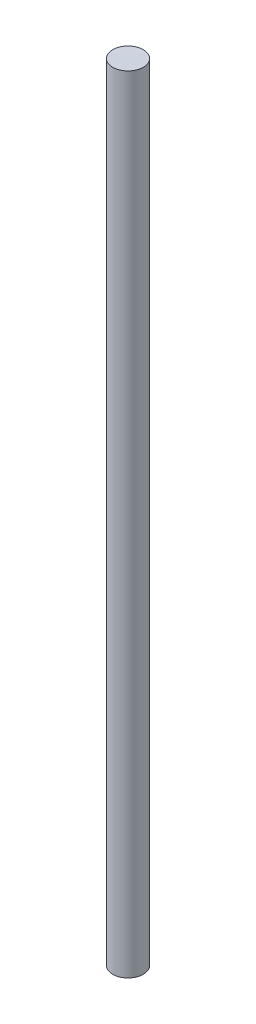
ISO-10303-21;
HEADER;
FILE_DESCRIPTION(('STEP AP214'),'2;1');
FILE_NAME('part.step','',(''),(''),'','','');
FILE_SCHEMA(('AUTOMOTIVE_DESIGN { 1 0 10303 214 1 1 1 1 }'));
ENDSEC;
DATA;
#1=APPLICATION_CONTEXT('core data for automotive mechanical design processes');
#2=APPLICATION_PROTOCOL_DEFINITION('international standard','automotive_design',2000,#1);
#3=PRODUCT_CONTEXT('',#1,'mechanical');
#4=PRODUCT('Part','Part','',(#3));
#5=PRODUCT_RELATED_PRODUCT_CATEGORY('part','',(#4));
#6=PRODUCT_DEFINITION_FORMATION('','',#4);
#7=PRODUCT_DEFINITION_CONTEXT('part definition',#1,'design');
#8=PRODUCT_DEFINITION('design','',#6,#7);
#9=PRODUCT_DEFINITION_SHAPE('','',#8);
#10=(LENGTH_UNIT() NAMED_UNIT(*) SI_UNIT(.MILLI.,.METRE.));
#11=(NAMED_UNIT(*) PLANE_ANGLE_UNIT() SI_UNIT($,.RADIAN.));
#12=(NAMED_UNIT(*) SI_UNIT($,.STERADIAN.) SOLID_ANGLE_UNIT());
#13=UNCERTAINTY_MEASURE_WITH_UNIT(LENGTH_MEASURE(1.E-05),#10,'distance_accuracy_value','');
#14=(GEOMETRIC_REPRESENTATION_CONTEXT(3) GLOBAL_UNCERTAINTY_ASSIGNED_CONTEXT((#13)) GLOBAL_UNIT_ASSIGNED_CONTEXT((#10,
#11,#12)) REPRESENTATION_CONTEXT('',''));
#15=CARTESIAN_POINT('',(0.,0.,0.));
#16=DIRECTION('',(0.,0.,1.));
#17=DIRECTION('',(1.,0.,0.));
#18=AXIS2_PLACEMENT_3D('',#15,#16,#17);
#19=CARTESIAN_POINT('',(72.,-211.566108500894,-49.));
#20=DIRECTION('',(0.,1.,0.));
#21=DIRECTION('',(0.,0.,1.));
#22=AXIS2_PLACEMENT_3D('',#19,#20,#21);
#23=CYLINDRICAL_SURFACE('',#22,4.04999999999999);
#24=CARTESIAN_POINT('',(72.,-211.566108500894,-49.));
#25=DIRECTION('',(0.,-1.,0.));
#26=DIRECTION('',(0.,0.,-1.));
#27=AXIS2_PLACEMENT_3D('',#24,#25,#26);
#28=CIRCLE('',#27,4.04999999999999);
#29=CARTESIAN_POINT('',(72.,-211.566108500894,-53.05));
#30=VERTEX_POINT('',#29);
#31=EDGE_CURVE('E10',#30,#30,#28,.T.);
#32=ORIENTED_EDGE('',*,*,#31,.F.);
#33=EDGE_LOOP('',(#32));
#34=FACE_BOUND('',#33,.T.);
#35=CARTESIAN_POINT('',(72.,-3.4,-49.));
#36=DIRECTION('',(0.,-1.,0.));
#37=DIRECTION('',(0.,0.,-1.));
#38=AXIS2_PLACEMENT_3D('',#35,#36,#37);
#39=CIRCLE('',#38,4.04999999999999);
#40=CARTESIAN_POINT('',(72.,-3.4,-53.05));
#41=VERTEX_POINT('',#40);
#42=EDGE_CURVE('E35',#41,#41,#39,.T.);
#43=ORIENTED_EDGE('',*,*,#42,.T.);
#44=EDGE_LOOP('',(#43));
#45=FACE_BOUND('',#44,.T.);
#46=ADVANCED_FACE('F32',(#34,#45),#23,.T.);
#47=CARTESIAN_POINT('',(72.,-211.566108500894,-49.));
#48=DIRECTION('',(0.,-1.,0.));
#49=DIRECTION('',(0.,0.,-1.));
#50=AXIS2_PLACEMENT_3D('',#47,#48,#49);
#51=PLANE('',#50);
#52=ORIENTED_EDGE('',*,*,#31,.T.);
#53=EDGE_LOOP('',(#52));
#54=FACE_BOUND('',#53,.T.);
#55=ADVANCED_FACE('F47',(#54),#51,.T.);
#56=CARTESIAN_POINT('',(72.,-3.4,-49.));
#57=DIRECTION('',(0.,-1.,0.));
#58=DIRECTION('',(0.,0.,-1.));
#59=AXIS2_PLACEMENT_3D('',#56,#57,#58);
#60=PLANE('',#59);
#61=ORIENTED_EDGE('',*,*,#42,.F.);
#62=EDGE_LOOP('',(#61));
#63=FACE_BOUND('',#62,.T.);
#64=ADVANCED_FACE('F45',(#63),#60,.F.);
#65=CLOSED_SHELL('',(#46,#55,#64));
#66=MANIFOLD_SOLID_BREP('B2',#65);
#67=ADVANCED_BREP_SHAPE_REPRESENTATION('',(#18,#66),#14);
#68=SHAPE_DEFINITION_REPRESENTATION(#9,#67);
ENDSEC;
END-ISO-10303-21;
